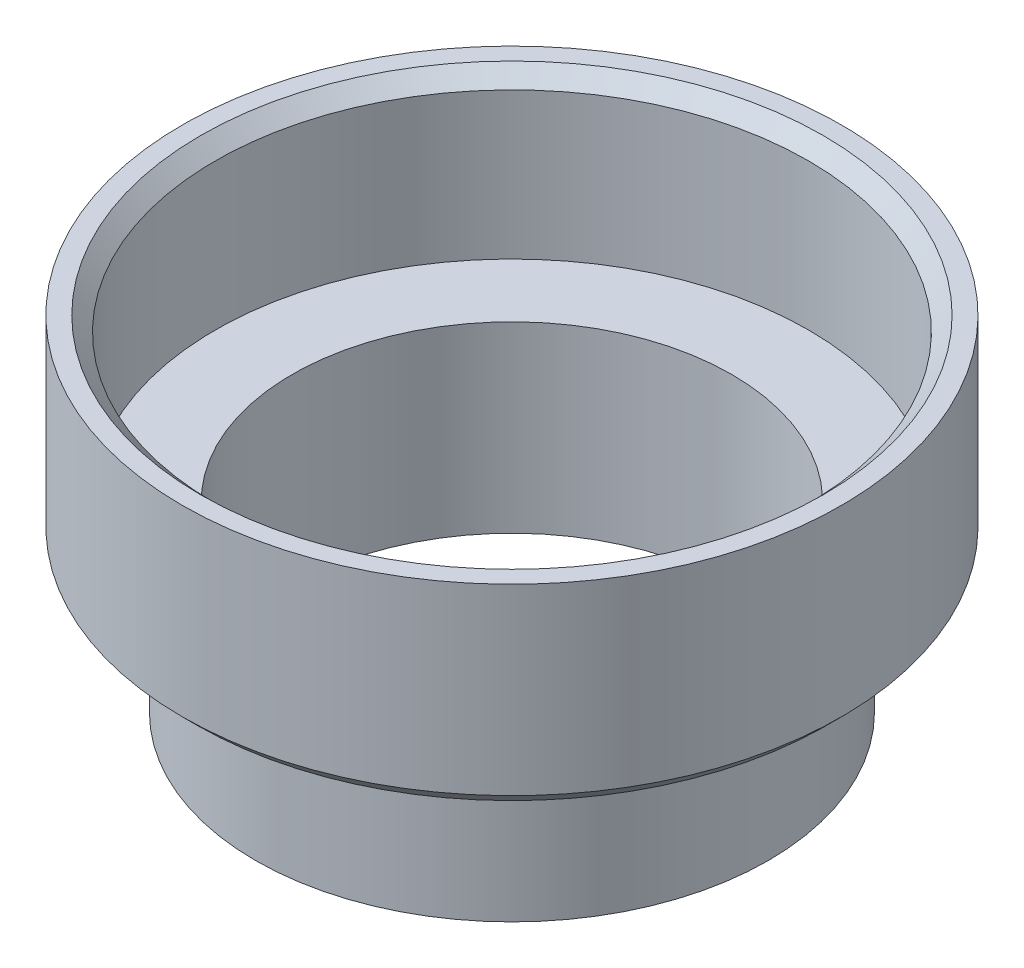
ISO-10303-21;
HEADER;
FILE_DESCRIPTION(('STEP AP214'),'2;1');
FILE_NAME('part.step','',(''),(''),'','','');
FILE_SCHEMA(('AUTOMOTIVE_DESIGN { 1 0 10303 214 1 1 1 1 }'));
ENDSEC;
DATA;
#1=APPLICATION_CONTEXT('core data for automotive mechanical design processes');
#2=APPLICATION_PROTOCOL_DEFINITION('international standard','automotive_design',2000,#1);
#3=PRODUCT_CONTEXT('',#1,'mechanical');
#4=PRODUCT('Part','Part','',(#3));
#5=PRODUCT_RELATED_PRODUCT_CATEGORY('part','',(#4));
#6=PRODUCT_DEFINITION_FORMATION('','',#4);
#7=PRODUCT_DEFINITION_CONTEXT('part definition',#1,'design');
#8=PRODUCT_DEFINITION('design','',#6,#7);
#9=PRODUCT_DEFINITION_SHAPE('','',#8);
#10=(LENGTH_UNIT() NAMED_UNIT(*) SI_UNIT(.MILLI.,.METRE.));
#11=(NAMED_UNIT(*) PLANE_ANGLE_UNIT() SI_UNIT($,.RADIAN.));
#12=(NAMED_UNIT(*) SI_UNIT($,.STERADIAN.) SOLID_ANGLE_UNIT());
#13=UNCERTAINTY_MEASURE_WITH_UNIT(LENGTH_MEASURE(1.E-05),#10,'distance_accuracy_value','');
#14=(GEOMETRIC_REPRESENTATION_CONTEXT(3) GLOBAL_UNCERTAINTY_ASSIGNED_CONTEXT((#13)) GLOBAL_UNIT_ASSIGNED_CONTEXT((#10,
#11,#12)) REPRESENTATION_CONTEXT('',''));
#15=CARTESIAN_POINT('',(0.,0.,0.));
#16=DIRECTION('',(0.,0.,1.));
#17=DIRECTION('',(1.,0.,0.));
#18=AXIS2_PLACEMENT_3D('',#15,#16,#17);
#19=CARTESIAN_POINT('',(0.,30.,0.));
#20=DIRECTION('',(0.,-1.,0.));
#21=DIRECTION('',(0.,0.,-1.));
#22=AXIS2_PLACEMENT_3D('',#19,#20,#21);
#23=CYLINDRICAL_SURFACE('',#22,30.);
#24=CARTESIAN_POINT('',(0.,0.,0.));
#25=DIRECTION('',(0.,1.,0.));
#26=DIRECTION('',(0.,0.,1.));
#27=AXIS2_PLACEMENT_3D('',#24,#25,#26);
#28=CIRCLE('',#27,30.);
#29=CARTESIAN_POINT('',(0.,0.,30.));
#30=VERTEX_POINT('',#29);
#31=EDGE_CURVE('E80',#30,#30,#28,.T.);
#32=ORIENTED_EDGE('',*,*,#31,.F.);
#33=EDGE_LOOP('',(#32));
#34=FACE_BOUND('',#33,.T.);
#35=CARTESIAN_POINT('',(0.,25.,0.));
#36=DIRECTION('',(0.,1.,0.));
#37=DIRECTION('',(0.,0.,1.));
#38=AXIS2_PLACEMENT_3D('',#35,#36,#37);
#39=CIRCLE('',#38,30.);
#40=CARTESIAN_POINT('',(0.,25.,30.));
#41=VERTEX_POINT('',#40);
#42=EDGE_CURVE('E91',#41,#41,#39,.T.);
#43=ORIENTED_EDGE('',*,*,#42,.T.);
#44=EDGE_LOOP('',(#43));
#45=FACE_BOUND('',#44,.T.);
#46=ADVANCED_FACE('F45',(#34,#45),#23,.F.);
#47=CARTESIAN_POINT('',(0.,30.,0.));
#48=DIRECTION('',(0.,-1.,0.));
#49=DIRECTION('',(0.,0.,-1.));
#50=AXIS2_PLACEMENT_3D('',#47,#48,#49);
#51=CYLINDRICAL_SURFACE('',#50,35.);
#52=CARTESIAN_POINT('',(0.,0.,0.));
#53=DIRECTION('',(0.,1.,0.));
#54=DIRECTION('',(0.,0.,1.));
#55=AXIS2_PLACEMENT_3D('',#52,#53,#54);
#56=CIRCLE('',#55,35.);
#57=CARTESIAN_POINT('',(0.,0.,35.));
#58=VERTEX_POINT('',#57);
#59=EDGE_CURVE('E76',#58,#58,#56,.T.);
#60=ORIENTED_EDGE('',*,*,#59,.T.);
#61=EDGE_LOOP('',(#60));
#62=FACE_BOUND('',#61,.T.);
#63=CARTESIAN_POINT('',(0.,20.,0.));
#64=DIRECTION('',(0.,1.,0.));
#65=DIRECTION('',(0.,0.,1.));
#66=AXIS2_PLACEMENT_3D('',#63,#64,#65);
#67=CIRCLE('',#66,35.);
#68=CARTESIAN_POINT('',(0.,20.,35.));
#69=VERTEX_POINT('',#68);
#70=EDGE_CURVE('E75',#69,#69,#67,.T.);
#71=ORIENTED_EDGE('',*,*,#70,.F.);
#72=EDGE_LOOP('',(#71));
#73=FACE_BOUND('',#72,.T.);
#74=ADVANCED_FACE('F117',(#62,#73),#51,.T.);
#75=CARTESIAN_POINT('',(0.,0.,0.));
#76=DIRECTION('',(0.,1.,0.));
#77=DIRECTION('',(0.,0.,1.));
#78=AXIS2_PLACEMENT_3D('',#75,#76,#77);
#79=PLANE('',#78);
#80=ORIENTED_EDGE('',*,*,#59,.F.);
#81=EDGE_LOOP('',(#80));
#82=FACE_BOUND('',#81,.T.);
#83=ORIENTED_EDGE('',*,*,#31,.T.);
#84=EDGE_LOOP('',(#83));
#85=FACE_BOUND('',#84,.T.);
#86=ADVANCED_FACE('F112',(#82,#85),#79,.F.);
#87=CARTESIAN_POINT('',(0.,20.,0.));
#88=DIRECTION('',(0.,1.,0.));
#89=DIRECTION('',(0.,0.,1.));
#90=AXIS2_PLACEMENT_3D('',#87,#88,#89);
#91=PLANE('',#90);
#92=CARTESIAN_POINT('',(0.,20.,0.));
#93=DIRECTION('',(0.,1.,0.));
#94=DIRECTION('',(0.,0.,1.));
#95=AXIS2_PLACEMENT_3D('',#92,#93,#94);
#96=CIRCLE('',#95,43.);
#97=CARTESIAN_POINT('',(0.,20.,43.));
#98=VERTEX_POINT('',#97);
#99=EDGE_CURVE('E59',#98,#98,#96,.F.);
#100=ORIENTED_EDGE('',*,*,#99,.T.);
#101=EDGE_LOOP('',(#100));
#102=FACE_BOUND('',#101,.T.);
#103=ORIENTED_EDGE('',*,*,#70,.T.);
#104=EDGE_LOOP('',(#103));
#105=FACE_BOUND('',#104,.T.);
#106=ADVANCED_FACE('F101',(#102,#105),#91,.F.);
#107=CARTESIAN_POINT('',(0.,25.,0.));
#108=DIRECTION('',(0.,1.,0.));
#109=DIRECTION('',(0.,0.,1.));
#110=AXIS2_PLACEMENT_3D('',#107,#108,#109);
#111=PLANE('',#110);
#112=CARTESIAN_POINT('',(0.,25.,0.));
#113=DIRECTION('',(0.,1.,0.));
#114=DIRECTION('',(0.,0.,1.));
#115=AXIS2_PLACEMENT_3D('',#112,#113,#114);
#116=CIRCLE('',#115,40.5);
#117=CARTESIAN_POINT('',(0.,25.,40.5));
#118=VERTEX_POINT('',#117);
#119=EDGE_CURVE('E71',#118,#118,#116,.F.);
#120=ORIENTED_EDGE('',*,*,#119,.F.);
#121=EDGE_LOOP('',(#120));
#122=FACE_BOUND('',#121,.T.);
#123=ORIENTED_EDGE('',*,*,#42,.F.);
#124=EDGE_LOOP('',(#123));
#125=FACE_BOUND('',#124,.T.);
#126=ADVANCED_FACE('F98',(#122,#125),#111,.T.);
#127=CARTESIAN_POINT('',(0.,20.,0.));
#128=DIRECTION('',(0.,1.,0.));
#129=DIRECTION('',(0.,0.,1.));
#130=AXIS2_PLACEMENT_3D('',#127,#128,#129);
#131=CYLINDRICAL_SURFACE('',#130,45.);
#132=CARTESIAN_POINT('',(0.,22.,0.));
#133=DIRECTION('',(0.,1.,0.));
#134=DIRECTION('',(0.,0.,1.));
#135=AXIS2_PLACEMENT_3D('',#132,#133,#134);
#136=CIRCLE('',#135,45.);
#137=CARTESIAN_POINT('',(0.,22.,45.));
#138=VERTEX_POINT('',#137);
#139=EDGE_CURVE('E65',#138,#138,#136,.T.);
#140=ORIENTED_EDGE('',*,*,#139,.T.);
#141=EDGE_LOOP('',(#140));
#142=FACE_BOUND('',#141,.T.);
#143=CARTESIAN_POINT('',(0.,47.,0.));
#144=DIRECTION('',(0.,1.,0.));
#145=DIRECTION('',(0.,0.,1.));
#146=AXIS2_PLACEMENT_3D('',#143,#144,#145);
#147=CIRCLE('',#146,45.);
#148=CARTESIAN_POINT('',(0.,47.,45.));
#149=VERTEX_POINT('',#148);
#150=EDGE_CURVE('E84',#149,#149,#147,.T.);
#151=ORIENTED_EDGE('',*,*,#150,.F.);
#152=EDGE_LOOP('',(#151));
#153=FACE_BOUND('',#152,.T.);
#154=ADVANCED_FACE('F100',(#142,#153),#131,.T.);
#155=CARTESIAN_POINT('',(0.,47.,0.));
#156=DIRECTION('',(0.,1.,0.));
#157=DIRECTION('',(0.,0.,1.));
#158=AXIS2_PLACEMENT_3D('',#155,#156,#157);
#159=PLANE('',#158);
#160=CARTESIAN_POINT('',(0.,47.,0.));
#161=DIRECTION('',(0.,1.,0.));
#162=DIRECTION('',(0.,0.,1.));
#163=AXIS2_PLACEMENT_3D('',#160,#161,#162);
#164=CIRCLE('',#163,42.5);
#165=CARTESIAN_POINT('',(0.,47.,42.5));
#166=VERTEX_POINT('',#165);
#167=EDGE_CURVE('E10',#166,#166,#164,.F.);
#168=ORIENTED_EDGE('',*,*,#167,.T.);
#169=EDGE_LOOP('',(#168));
#170=FACE_BOUND('',#169,.T.);
#171=ORIENTED_EDGE('',*,*,#150,.T.);
#172=EDGE_LOOP('',(#171));
#173=FACE_BOUND('',#172,.T.);
#174=ADVANCED_FACE('F108',(#170,#173),#159,.T.);
#175=CARTESIAN_POINT('',(0.,47.,0.));
#176=DIRECTION('',(0.,-1.,0.));
#177=DIRECTION('',(0.,0.,-1.));
#178=AXIS2_PLACEMENT_3D('',#175,#176,#177);
#179=CYLINDRICAL_SURFACE('',#178,40.5);
#180=CARTESIAN_POINT('',(0.,45.,0.));
#181=DIRECTION('',(0.,1.,0.));
#182=DIRECTION('',(0.,0.,1.));
#183=AXIS2_PLACEMENT_3D('',#180,#181,#182);
#184=CIRCLE('',#183,40.5);
#185=CARTESIAN_POINT('',(0.,45.,40.5));
#186=VERTEX_POINT('',#185);
#187=EDGE_CURVE('E53',#186,#186,#184,.T.);
#188=ORIENTED_EDGE('',*,*,#187,.T.);
#189=EDGE_LOOP('',(#188));
#190=FACE_BOUND('',#189,.T.);
#191=ORIENTED_EDGE('',*,*,#119,.T.);
#192=EDGE_LOOP('',(#191));
#193=FACE_BOUND('',#192,.T.);
#194=ADVANCED_FACE('F131',(#190,#193),#179,.F.);
#195=CARTESIAN_POINT('',(0.,22.,0.));
#196=DIRECTION('',(0.,1.,0.));
#197=DIRECTION('',(0.,0.,1.));
#198=AXIS2_PLACEMENT_3D('',#195,#196,#197);
#199=CONICAL_SURFACE('',#198,45.,0.78539816339745);
#200=ORIENTED_EDGE('',*,*,#99,.F.);
#201=EDGE_LOOP('',(#200));
#202=FACE_BOUND('',#201,.T.);
#203=ORIENTED_EDGE('',*,*,#139,.F.);
#204=EDGE_LOOP('',(#203));
#205=FACE_BOUND('',#204,.T.);
#206=ADVANCED_FACE('F129',(#202,#205),#199,.T.);
#207=CARTESIAN_POINT('',(0.,45.,0.));
#208=DIRECTION('',(0.,1.,0.));
#209=DIRECTION('',(0.,0.,1.));
#210=AXIS2_PLACEMENT_3D('',#207,#208,#209);
#211=CONICAL_SURFACE('',#210,40.5,0.785398163397448);
#212=ORIENTED_EDGE('',*,*,#167,.F.);
#213=EDGE_LOOP('',(#212));
#214=FACE_BOUND('',#213,.T.);
#215=ORIENTED_EDGE('',*,*,#187,.F.);
#216=EDGE_LOOP('',(#215));
#217=FACE_BOUND('',#216,.T.);
#218=ADVANCED_FACE('F47',(#214,#217),#211,.F.);
#219=CLOSED_SHELL('',(#46,#74,#86,#106,#126,#154,#174,#194,#206,#218));
#220=MANIFOLD_SOLID_BREP('B2',#219);
#221=ADVANCED_BREP_SHAPE_REPRESENTATION('',(#18,#220),#14);
#222=SHAPE_DEFINITION_REPRESENTATION(#9,#221);
ENDSEC;
END-ISO-10303-21;
